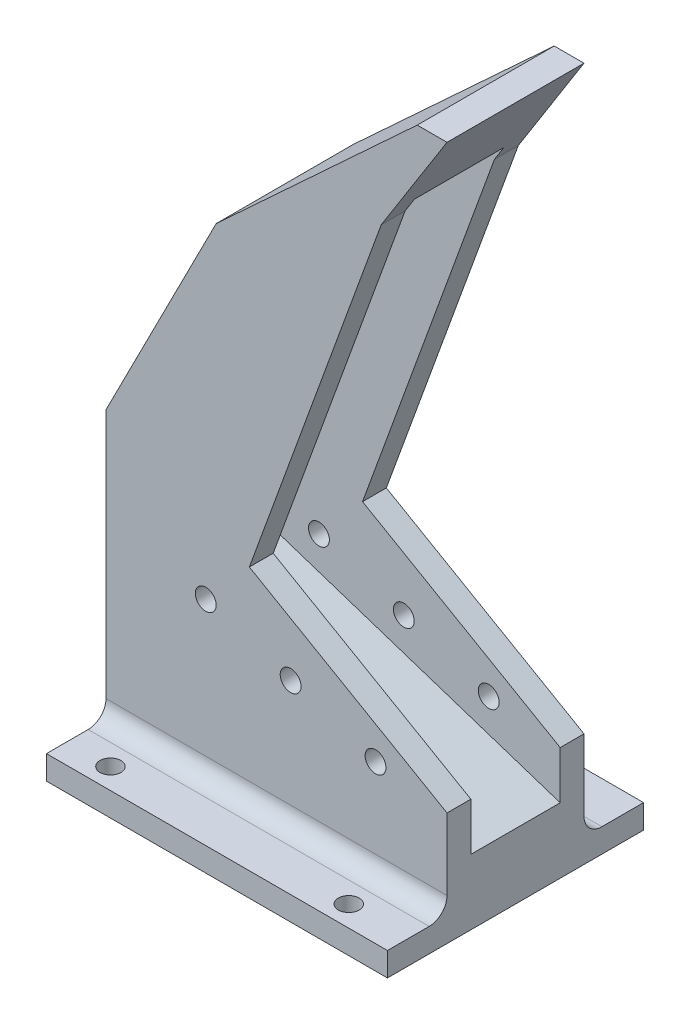
ISO-10303-21;
HEADER;
FILE_DESCRIPTION(('STEP AP214'),'2;1');
FILE_NAME('part.step','',(''),(''),'','','');
FILE_SCHEMA(('AUTOMOTIVE_DESIGN { 1 0 10303 214 1 1 1 1 }'));
ENDSEC;
DATA;
#1=APPLICATION_CONTEXT('core data for automotive mechanical design processes');
#2=APPLICATION_PROTOCOL_DEFINITION('international standard','automotive_design',2000,#1);
#3=PRODUCT_CONTEXT('',#1,'mechanical');
#4=PRODUCT('Part','Part','',(#3));
#5=PRODUCT_RELATED_PRODUCT_CATEGORY('part','',(#4));
#6=PRODUCT_DEFINITION_FORMATION('','',#4);
#7=PRODUCT_DEFINITION_CONTEXT('part definition',#1,'design');
#8=PRODUCT_DEFINITION('design','',#6,#7);
#9=PRODUCT_DEFINITION_SHAPE('','',#8);
#10=(LENGTH_UNIT() NAMED_UNIT(*) SI_UNIT(.MILLI.,.METRE.));
#11=(NAMED_UNIT(*) PLANE_ANGLE_UNIT() SI_UNIT($,.RADIAN.));
#12=(NAMED_UNIT(*) SI_UNIT($,.STERADIAN.) SOLID_ANGLE_UNIT());
#13=UNCERTAINTY_MEASURE_WITH_UNIT(LENGTH_MEASURE(1.E-05),#10,'distance_accuracy_value','');
#14=(GEOMETRIC_REPRESENTATION_CONTEXT(3) GLOBAL_UNCERTAINTY_ASSIGNED_CONTEXT((#13)) GLOBAL_UNIT_ASSIGNED_CONTEXT((#10,
#11,#12)) REPRESENTATION_CONTEXT('',''));
#15=CARTESIAN_POINT('',(0.,0.,0.));
#16=DIRECTION('',(0.,0.,1.));
#17=DIRECTION('',(1.,0.,0.));
#18=AXIS2_PLACEMENT_3D('',#15,#16,#17);
#19=CARTESIAN_POINT('',(57.2500555458633,0.,11.5));
#20=DIRECTION('',(-1.,0.,0.));
#21=DIRECTION('',(0.,0.,1.));
#22=AXIS2_PLACEMENT_3D('',#19,#20,#21);
#23=PLANE('',#22);
#24=DIRECTION('',(0.,1.,0.));
#25=VECTOR('',#24,1.);
#26=CARTESIAN_POINT('',(57.2500555458633,0.,11.5));
#27=LINE('',#26,#25);
#28=CARTESIAN_POINT('',(57.2500555458633,3.,11.5));
#29=VERTEX_POINT('',#28);
#30=CARTESIAN_POINT('',(57.2500555458633,15.,11.5));
#31=VERTEX_POINT('',#30);
#32=EDGE_CURVE('E381',#29,#31,#27,.T.);
#33=ORIENTED_EDGE('',*,*,#32,.F.);
#34=CARTESIAN_POINT('',(57.2500555458633,3.,14.5));
#35=DIRECTION('',(-1.,0.,0.));
#36=DIRECTION('',(0.,0.,1.));
#37=AXIS2_PLACEMENT_3D('',#34,#35,#36);
#38=CIRCLE('',#37,3.);
#39=CARTESIAN_POINT('',(57.2500555458633,0.,14.5));
#40=VERTEX_POINT('',#39);
#41=EDGE_CURVE('E455',#29,#40,#38,.T.);
#42=ORIENTED_EDGE('',*,*,#41,.T.);
#43=DIRECTION('',(0.,0.,1.));
#44=VECTOR('',#43,1.);
#45=CARTESIAN_POINT('',(57.2500555458633,0.,21.5));
#46=LINE('',#45,#44);
#47=CARTESIAN_POINT('',(57.2500555458633,0.,21.5));
#48=VERTEX_POINT('',#47);
#49=EDGE_CURVE('E276',#40,#48,#46,.T.);
#50=ORIENTED_EDGE('',*,*,#49,.T.);
#51=DIRECTION('',(0.,1.,0.));
#52=VECTOR('',#51,1.);
#53=CARTESIAN_POINT('',(57.2500555458633,-4.,21.5));
#54=LINE('',#53,#52);
#55=CARTESIAN_POINT('',(57.2500555458633,-4.,21.5));
#56=VERTEX_POINT('',#55);
#57=EDGE_CURVE('E258',#56,#48,#54,.T.);
#58=ORIENTED_EDGE('',*,*,#57,.F.);
#59=DIRECTION('',(0.,0.,1.));
#60=VECTOR('',#59,1.);
#61=CARTESIAN_POINT('',(57.2500555458633,-4.,21.5));
#62=LINE('',#61,#60);
#63=CARTESIAN_POINT('',(57.2500555458633,-4.,-21.5));
#64=VERTEX_POINT('',#63);
#65=EDGE_CURVE('E264',#64,#56,#62,.T.);
#66=ORIENTED_EDGE('',*,*,#65,.F.);
#67=DIRECTION('',(0.,1.,0.));
#68=VECTOR('',#67,1.);
#69=CARTESIAN_POINT('',(57.2500555458633,-4.,-21.5));
#70=LINE('',#69,#68);
#71=CARTESIAN_POINT('',(57.2500555458633,0.,-21.5));
#72=VERTEX_POINT('',#71);
#73=EDGE_CURVE('E490',#64,#72,#70,.T.);
#74=ORIENTED_EDGE('',*,*,#73,.T.);
#75=CARTESIAN_POINT('',(57.2500555458633,0.,-14.5));
#76=VERTEX_POINT('',#75);
#77=EDGE_CURVE('E477',#72,#76,#46,.T.);
#78=ORIENTED_EDGE('',*,*,#77,.T.);
#79=CARTESIAN_POINT('',(57.2500555458633,3.,-14.5));
#80=DIRECTION('',(-1.,0.,0.));
#81=DIRECTION('',(0.,0.,1.));
#82=AXIS2_PLACEMENT_3D('',#79,#80,#81);
#83=CIRCLE('',#82,3.);
#84=CARTESIAN_POINT('',(57.2500555458633,3.,-11.5));
#85=VERTEX_POINT('',#84);
#86=EDGE_CURVE('E102',#76,#85,#83,.T.);
#87=ORIENTED_EDGE('',*,*,#86,.T.);
#88=DIRECTION('',(0.,1.,0.));
#89=VECTOR('',#88,1.);
#90=CARTESIAN_POINT('',(57.2500555458633,0.,-11.5));
#91=LINE('',#90,#89);
#92=CARTESIAN_POINT('',(57.2500555458633,15.,-11.5));
#93=VERTEX_POINT('',#92);
#94=EDGE_CURVE('E401',#85,#93,#91,.T.);
#95=ORIENTED_EDGE('',*,*,#94,.T.);
#96=DIRECTION('',(0.,0.,-1.));
#97=VECTOR('',#96,1.);
#98=CARTESIAN_POINT('',(57.2500555458633,15.,11.5));
#99=LINE('',#98,#97);
#100=CARTESIAN_POINT('',(57.2500555458633,15.,-7.5));
#101=VERTEX_POINT('',#100);
#102=EDGE_CURVE('E415',#101,#93,#99,.T.);
#103=ORIENTED_EDGE('',*,*,#102,.F.);
#104=DIRECTION('',(0.,1.,0.));
#105=VECTOR('',#104,1.);
#106=CARTESIAN_POINT('',(57.2500555458633,0.,-7.5));
#107=LINE('',#106,#105);
#108=CARTESIAN_POINT('',(57.2500555458633,6.97368477004083,-7.5));
#109=VERTEX_POINT('',#108);
#110=EDGE_CURVE('E363',#109,#101,#107,.T.);
#111=ORIENTED_EDGE('',*,*,#110,.F.);
#112=DIRECTION('',(0.,0.,1.));
#113=VECTOR('',#112,1.);
#114=CARTESIAN_POINT('',(57.2500555458633,6.97368477004083,-7.5));
#115=LINE('',#114,#113);
#116=CARTESIAN_POINT('',(57.2500555458633,6.97368477004083,7.5));
#117=VERTEX_POINT('',#116);
#118=EDGE_CURVE('E326',#109,#117,#115,.T.);
#119=ORIENTED_EDGE('',*,*,#118,.T.);
#120=DIRECTION('',(0.,1.,0.));
#121=VECTOR('',#120,1.);
#122=CARTESIAN_POINT('',(57.2500555458633,0.,7.5));
#123=LINE('',#122,#121);
#124=CARTESIAN_POINT('',(57.2500555458633,15.,7.5));
#125=VERTEX_POINT('',#124);
#126=EDGE_CURVE('E355',#117,#125,#123,.T.);
#127=ORIENTED_EDGE('',*,*,#126,.T.);
#128=EDGE_CURVE('E416',#31,#125,#99,.T.);
#129=ORIENTED_EDGE('',*,*,#128,.F.);
#130=EDGE_LOOP('',(#33,#42,#50,#58,#66,#74,#78,#87,#95,#103,#111,#119,#127,#129));
#131=FACE_BOUND('',#130,.T.);
#132=ADVANCED_FACE('F94',(#131),#23,.F.);
#133=CARTESIAN_POINT('',(57.2500555458633,15.,11.5));
#134=DIRECTION('',(-0.499999999999995,-0.866025403784442,0.));
#135=DIRECTION('',(0.866025403784442,-0.499999999999995,0.));
#136=AXIS2_PLACEMENT_3D('',#133,#134,#135);
#137=PLANE('',#136);
#138=DIRECTION('',(-0.866025403784442,0.499999999999995,0.));
#139=VECTOR('',#138,1.);
#140=CARTESIAN_POINT('',(57.2500555458633,15.,-7.5));
#141=LINE('',#140,#139);
#142=CARTESIAN_POINT('',(24.0660110218741,34.1588170387254,-7.5));
#143=VERTEX_POINT('',#142);
#144=EDGE_CURVE('E361',#101,#143,#141,.T.);
#145=ORIENTED_EDGE('',*,*,#144,.F.);
#146=ORIENTED_EDGE('',*,*,#102,.T.);
#147=DIRECTION('',(-0.866025403784442,0.499999999999995,0.));
#148=VECTOR('',#147,1.);
#149=CARTESIAN_POINT('',(57.2500555458633,15.,-11.5));
#150=LINE('',#149,#148);
#151=CARTESIAN_POINT('',(24.0660110218741,34.1588170387254,-11.5));
#152=VERTEX_POINT('',#151);
#153=EDGE_CURVE('E403',#93,#152,#150,.T.);
#154=ORIENTED_EDGE('',*,*,#153,.T.);
#155=DIRECTION('',(0.,0.,-1.));
#156=VECTOR('',#155,1.);
#157=CARTESIAN_POINT('',(24.0660110218741,34.1588170387254,11.5));
#158=LINE('',#157,#156);
#159=EDGE_CURVE('E411',#143,#152,#158,.T.);
#160=ORIENTED_EDGE('',*,*,#159,.F.);
#161=EDGE_LOOP('',(#145,#146,#154,#160));
#162=FACE_BOUND('',#161,.T.);
#163=ADVANCED_FACE('F533',(#162),#137,.F.);
#164=CARTESIAN_POINT('',(24.0660110218741,34.1588170387254,11.5));
#165=DIRECTION('',(-0.93969262078591,0.342020143325665,0.));
#166=DIRECTION('',(-0.342020143325665,-0.93969262078591,0.));
#167=AXIS2_PLACEMENT_3D('',#164,#165,#166);
#168=PLANE('',#167);
#169=DIRECTION('',(0.342020143325665,0.93969262078591,0.));
#170=VECTOR('',#169,1.);
#171=CARTESIAN_POINT('',(24.0660110218741,34.1588170387254,-7.5));
#172=LINE('',#171,#170);
#173=CARTESIAN_POINT('',(46.2103906373218,95.,-7.5));
#174=VERTEX_POINT('',#173);
#175=EDGE_CURVE('E430',#143,#174,#172,.T.);
#176=ORIENTED_EDGE('',*,*,#175,.F.);
#177=ORIENTED_EDGE('',*,*,#159,.T.);
#178=DIRECTION('',(0.342020143325665,0.93969262078591,0.));
#179=VECTOR('',#178,1.);
#180=CARTESIAN_POINT('',(24.0660110218741,34.1588170387254,-11.5));
#181=LINE('',#180,#179);
#182=CARTESIAN_POINT('',(46.2103906373218,95.,-11.5));
#183=VERTEX_POINT('',#182);
#184=EDGE_CURVE('E372',#152,#183,#181,.T.);
#185=ORIENTED_EDGE('',*,*,#184,.T.);
#186=DIRECTION('',(0.,0.,-1.));
#187=VECTOR('',#186,1.);
#188=CARTESIAN_POINT('',(46.2103906373218,95.,11.5));
#189=LINE('',#188,#187);
#190=EDGE_CURVE('E387',#174,#183,#189,.T.);
#191=ORIENTED_EDGE('',*,*,#190,.F.);
#192=EDGE_LOOP('',(#176,#177,#185,#191));
#193=FACE_BOUND('',#192,.T.);
#194=ADVANCED_FACE('F527',(#193),#168,.F.);
#195=CARTESIAN_POINT('',(46.2103906373218,95.,11.5));
#196=DIRECTION('',(-0.845771719595629,0.533544935626094,0.));
#197=DIRECTION('',(-0.533544935626094,-0.845771719595629,0.));
#198=AXIS2_PLACEMENT_3D('',#195,#196,#197);
#199=PLANE('',#198);
#200=DIRECTION('',(0.,0.,1.));
#201=VECTOR('',#200,1.);
#202=CARTESIAN_POINT('',(47.7874856242563,97.5,-7.5));
#203=LINE('',#202,#201);
#204=CARTESIAN_POINT('',(47.7874856242563,97.5,-7.5));
#205=VERTEX_POINT('',#204);
#206=CARTESIAN_POINT('',(47.7874856242563,97.5,7.5));
#207=VERTEX_POINT('',#206);
#208=EDGE_CURVE('E340',#205,#207,#203,.T.);
#209=ORIENTED_EDGE('',*,*,#208,.F.);
#210=DIRECTION('',(0.533544935626094,0.845771719595629,0.));
#211=VECTOR('',#210,1.);
#212=CARTESIAN_POINT('',(46.2103906373218,95.,-7.5));
#213=LINE('',#212,#211);
#214=EDGE_CURVE('E365',#174,#205,#213,.T.);
#215=ORIENTED_EDGE('',*,*,#214,.F.);
#216=ORIENTED_EDGE('',*,*,#190,.T.);
#217=DIRECTION('',(0.533544935626094,0.845771719595629,0.));
#218=VECTOR('',#217,1.);
#219=CARTESIAN_POINT('',(46.2103906373218,95.,-11.5));
#220=LINE('',#219,#218);
#221=CARTESIAN_POINT('',(57.2500555458633,112.5,-11.5));
#222=VERTEX_POINT('',#221);
#223=EDGE_CURVE('E367',#183,#222,#220,.T.);
#224=ORIENTED_EDGE('',*,*,#223,.T.);
#225=DIRECTION('',(0.,0.,-1.));
#226=VECTOR('',#225,1.);
#227=CARTESIAN_POINT('',(57.2500555458633,112.5,11.5));
#228=LINE('',#227,#226);
#229=CARTESIAN_POINT('',(57.2500555458633,112.5,11.5));
#230=VERTEX_POINT('',#229);
#231=EDGE_CURVE('E425',#230,#222,#228,.T.);
#232=ORIENTED_EDGE('',*,*,#231,.F.);
#233=DIRECTION('',(0.533544935626094,0.845771719595629,0.));
#234=VECTOR('',#233,1.);
#235=CARTESIAN_POINT('',(46.2103906373218,95.,11.5));
#236=LINE('',#235,#234);
#237=CARTESIAN_POINT('',(46.2103906373218,95.,11.5));
#238=VERTEX_POINT('',#237);
#239=EDGE_CURVE('E368',#238,#230,#236,.T.);
#240=ORIENTED_EDGE('',*,*,#239,.F.);
#241=CARTESIAN_POINT('',(46.2103906373218,95.,7.5));
#242=VERTEX_POINT('',#241);
#243=EDGE_CURVE('E408',#238,#242,#189,.T.);
#244=ORIENTED_EDGE('',*,*,#243,.T.);
#245=DIRECTION('',(0.533544935626094,0.845771719595629,0.));
#246=VECTOR('',#245,1.);
#247=CARTESIAN_POINT('',(46.2103906373218,95.,7.5));
#248=LINE('',#247,#246);
#249=EDGE_CURVE('E358',#242,#207,#248,.T.);
#250=ORIENTED_EDGE('',*,*,#249,.T.);
#251=EDGE_LOOP('',(#209,#215,#216,#224,#232,#240,#244,#250));
#252=FACE_BOUND('',#251,.T.);
#253=ADVANCED_FACE('F521',(#252),#199,.F.);
#254=CARTESIAN_POINT('',(57.2500555458633,112.5,11.5));
#255=DIRECTION('',(0.,-1.,0.));
#256=DIRECTION('',(1.,0.,0.));
#257=AXIS2_PLACEMENT_3D('',#254,#255,#256);
#258=PLANE('',#257);
#259=ORIENTED_EDGE('',*,*,#231,.T.);
#260=DIRECTION('',(-1.,0.,0.));
#261=VECTOR('',#260,1.);
#262=CARTESIAN_POINT('',(57.2500555458633,112.5,-11.5));
#263=LINE('',#262,#261);
#264=CARTESIAN_POINT('',(52.2500555458633,112.5,-11.5));
#265=VERTEX_POINT('',#264);
#266=EDGE_CURVE('E390',#222,#265,#263,.T.);
#267=ORIENTED_EDGE('',*,*,#266,.T.);
#268=DIRECTION('',(0.,0.,-1.));
#269=VECTOR('',#268,1.);
#270=CARTESIAN_POINT('',(52.2500555458633,112.5,11.5));
#271=LINE('',#270,#269);
#272=CARTESIAN_POINT('',(52.2500555458633,112.5,11.5));
#273=VERTEX_POINT('',#272);
#274=EDGE_CURVE('E423',#273,#265,#271,.T.);
#275=ORIENTED_EDGE('',*,*,#274,.F.);
#276=DIRECTION('',(-1.,0.,0.));
#277=VECTOR('',#276,1.);
#278=CARTESIAN_POINT('',(57.2500555458633,112.5,11.5));
#279=LINE('',#278,#277);
#280=EDGE_CURVE('E371',#230,#273,#279,.T.);
#281=ORIENTED_EDGE('',*,*,#280,.F.);
#282=EDGE_LOOP('',(#259,#267,#275,#281));
#283=FACE_BOUND('',#282,.T.);
#284=ADVANCED_FACE('F515',(#283),#258,.F.);
#285=CARTESIAN_POINT('',(52.2500555458633,112.5,11.5));
#286=DIRECTION('',(0.678683956183813,-0.734430451178795,0.));
#287=DIRECTION('',(0.734430451178795,0.678683956183813,0.));
#288=AXIS2_PLACEMENT_3D('',#285,#286,#287);
#289=PLANE('',#288);
#290=ORIENTED_EDGE('',*,*,#274,.T.);
#291=DIRECTION('',(-0.734430451178795,-0.678683956183813,0.));
#292=VECTOR('',#291,1.);
#293=CARTESIAN_POINT('',(52.2500555458633,112.5,-11.5));
#294=LINE('',#293,#292);
#295=CARTESIAN_POINT('',(18.50330034999,81.3147716534072,-11.5));
#296=VERTEX_POINT('',#295);
#297=EDGE_CURVE('E393',#265,#296,#294,.T.);
#298=ORIENTED_EDGE('',*,*,#297,.T.);
#299=DIRECTION('',(0.,0.,-1.));
#300=VECTOR('',#299,1.);
#301=CARTESIAN_POINT('',(18.50330034999,81.3147716534072,11.5));
#302=LINE('',#301,#300);
#303=CARTESIAN_POINT('',(18.50330034999,81.3147716534072,11.5));
#304=VERTEX_POINT('',#303);
#305=EDGE_CURVE('E421',#304,#296,#302,.T.);
#306=ORIENTED_EDGE('',*,*,#305,.F.);
#307=DIRECTION('',(-0.734430451178795,-0.678683956183813,0.));
#308=VECTOR('',#307,1.);
#309=CARTESIAN_POINT('',(52.2500555458633,112.5,11.5));
#310=LINE('',#309,#308);
#311=EDGE_CURVE('E374',#273,#304,#310,.T.);
#312=ORIENTED_EDGE('',*,*,#311,.F.);
#313=EDGE_LOOP('',(#290,#298,#306,#312));
#314=FACE_BOUND('',#313,.T.);
#315=ADVANCED_FACE('F512',(#314),#289,.F.);
#316=CARTESIAN_POINT('',(18.50330034999,81.3147716534072,11.5));
#317=DIRECTION('',(0.891006524188366,-0.453990499739551,0.));
#318=DIRECTION('',(0.453990499739551,0.891006524188366,0.));
#319=AXIS2_PLACEMENT_3D('',#316,#317,#318);
#320=PLANE('',#319);
#321=ORIENTED_EDGE('',*,*,#305,.T.);
#322=DIRECTION('',(-0.453990499739551,-0.891006524188366,0.));
#323=VECTOR('',#322,1.);
#324=CARTESIAN_POINT('',(18.50330034999,81.3147716534072,-11.5));
#325=LINE('',#324,#323);
#326=CARTESIAN_POINT('',(0.,45.,-11.5));
#327=VERTEX_POINT('',#326);
#328=EDGE_CURVE('E396',#296,#327,#325,.T.);
#329=ORIENTED_EDGE('',*,*,#328,.T.);
#330=DIRECTION('',(0.,0.,-1.));
#331=VECTOR('',#330,1.);
#332=CARTESIAN_POINT('',(0.,45.,11.5));
#333=LINE('',#332,#331);
#334=CARTESIAN_POINT('',(0.,45.,11.5));
#335=VERTEX_POINT('',#334);
#336=EDGE_CURVE('E419',#335,#327,#333,.T.);
#337=ORIENTED_EDGE('',*,*,#336,.F.);
#338=DIRECTION('',(-0.453990499739551,-0.891006524188366,0.));
#339=VECTOR('',#338,1.);
#340=CARTESIAN_POINT('',(18.50330034999,81.3147716534072,11.5));
#341=LINE('',#340,#339);
#342=EDGE_CURVE('E376',#304,#335,#341,.T.);
#343=ORIENTED_EDGE('',*,*,#342,.F.);
#344=EDGE_LOOP('',(#321,#329,#337,#343));
#345=FACE_BOUND('',#344,.T.);
#346=ADVANCED_FACE('F508',(#345),#320,.F.);
#347=CARTESIAN_POINT('',(0.,45.,11.5));
#348=DIRECTION('',(1.,0.,0.));
#349=DIRECTION('',(0.,1.,0.));
#350=AXIS2_PLACEMENT_3D('',#347,#348,#349);
#351=PLANE('',#350);
#352=ORIENTED_EDGE('',*,*,#336,.T.);
#353=DIRECTION('',(0.,-1.,0.));
#354=VECTOR('',#353,1.);
#355=CARTESIAN_POINT('',(0.,45.,-11.5));
#356=LINE('',#355,#354);
#357=CARTESIAN_POINT('',(0.,3.00000000000002,-11.5));
#358=VERTEX_POINT('',#357);
#359=EDGE_CURVE('E399',#327,#358,#356,.T.);
#360=ORIENTED_EDGE('',*,*,#359,.T.);
#361=CARTESIAN_POINT('',(0.,3.,-14.5));
#362=DIRECTION('',(1.,0.,0.));
#363=DIRECTION('',(0.,1.,0.));
#364=AXIS2_PLACEMENT_3D('',#361,#362,#363);
#365=CIRCLE('',#364,3.);
#366=CARTESIAN_POINT('',(0.,0.,-14.5));
#367=VERTEX_POINT('',#366);
#368=EDGE_CURVE('E13',#358,#367,#365,.T.);
#369=ORIENTED_EDGE('',*,*,#368,.T.);
#370=DIRECTION('',(0.,0.,-1.));
#371=VECTOR('',#370,1.);
#372=CARTESIAN_POINT('',(0.,0.,21.5));
#373=LINE('',#372,#371);
#374=CARTESIAN_POINT('',(0.,0.,-21.5));
#375=VERTEX_POINT('',#374);
#376=EDGE_CURVE('E487',#367,#375,#373,.T.);
#377=ORIENTED_EDGE('',*,*,#376,.T.);
#378=DIRECTION('',(0.,1.,0.));
#379=VECTOR('',#378,1.);
#380=CARTESIAN_POINT('',(0.,-4.,-21.5));
#381=LINE('',#380,#379);
#382=CARTESIAN_POINT('',(0.,-4.,-21.5));
#383=VERTEX_POINT('',#382);
#384=EDGE_CURVE('E283',#383,#375,#381,.T.);
#385=ORIENTED_EDGE('',*,*,#384,.F.);
#386=DIRECTION('',(0.,0.,-1.));
#387=VECTOR('',#386,1.);
#388=CARTESIAN_POINT('',(0.,-4.,21.5));
#389=LINE('',#388,#387);
#390=CARTESIAN_POINT('',(0.,-4.,21.5));
#391=VERTEX_POINT('',#390);
#392=EDGE_CURVE('E263',#391,#383,#389,.T.);
#393=ORIENTED_EDGE('',*,*,#392,.F.);
#394=DIRECTION('',(0.,1.,0.));
#395=VECTOR('',#394,1.);
#396=CARTESIAN_POINT('',(0.,-4.,21.5));
#397=LINE('',#396,#395);
#398=CARTESIAN_POINT('',(0.,0.,21.5));
#399=VERTEX_POINT('',#398);
#400=EDGE_CURVE('E260',#391,#399,#397,.T.);
#401=ORIENTED_EDGE('',*,*,#400,.T.);
#402=CARTESIAN_POINT('',(0.,0.,14.5));
#403=VERTEX_POINT('',#402);
#404=EDGE_CURVE('E464',#399,#403,#373,.T.);
#405=ORIENTED_EDGE('',*,*,#404,.T.);
#406=CARTESIAN_POINT('',(0.,3.,14.5));
#407=DIRECTION('',(1.,0.,0.));
#408=DIRECTION('',(0.,1.,0.));
#409=AXIS2_PLACEMENT_3D('',#406,#407,#408);
#410=CIRCLE('',#409,3.);
#411=CARTESIAN_POINT('',(0.,3.00000000000002,11.5));
#412=VERTEX_POINT('',#411);
#413=EDGE_CURVE('E457',#403,#412,#410,.T.);
#414=ORIENTED_EDGE('',*,*,#413,.T.);
#415=DIRECTION('',(0.,-1.,0.));
#416=VECTOR('',#415,1.);
#417=CARTESIAN_POINT('',(0.,45.,11.5));
#418=LINE('',#417,#416);
#419=EDGE_CURVE('E378',#335,#412,#418,.T.);
#420=ORIENTED_EDGE('',*,*,#419,.F.);
#421=EDGE_LOOP('',(#352,#360,#369,#377,#385,#393,#401,#405,#414,#420));
#422=FACE_BOUND('',#421,.T.);
#423=ADVANCED_FACE('F462',(#422),#351,.F.);
#424=ORIENTED_EDGE('',*,*,#128,.T.);
#425=DIRECTION('',(-0.866025403784442,0.499999999999995,0.));
#426=VECTOR('',#425,1.);
#427=CARTESIAN_POINT('',(57.2500555458633,15.,7.5));
#428=LINE('',#427,#426);
#429=CARTESIAN_POINT('',(24.0660110218741,34.1588170387254,7.5));
#430=VERTEX_POINT('',#429);
#431=EDGE_CURVE('E342',#125,#430,#428,.T.);
#432=ORIENTED_EDGE('',*,*,#431,.T.);
#433=CARTESIAN_POINT('',(24.0660110218741,34.1588170387254,11.5));
#434=VERTEX_POINT('',#433);
#435=EDGE_CURVE('E412',#434,#430,#158,.T.);
#436=ORIENTED_EDGE('',*,*,#435,.F.);
#437=DIRECTION('',(-0.866025403784442,0.499999999999995,0.));
#438=VECTOR('',#437,1.);
#439=CARTESIAN_POINT('',(57.2500555458633,15.,11.5));
#440=LINE('',#439,#438);
#441=EDGE_CURVE('E383',#31,#434,#440,.T.);
#442=ORIENTED_EDGE('',*,*,#441,.F.);
#443=EDGE_LOOP('',(#424,#432,#436,#442));
#444=FACE_BOUND('',#443,.T.);
#445=ADVANCED_FACE('F570',(#444),#137,.F.);
#446=ORIENTED_EDGE('',*,*,#435,.T.);
#447=DIRECTION('',(0.342020143325665,0.93969262078591,0.));
#448=VECTOR('',#447,1.);
#449=CARTESIAN_POINT('',(24.0660110218741,34.1588170387254,7.5));
#450=LINE('',#449,#448);
#451=EDGE_CURVE('E427',#430,#242,#450,.T.);
#452=ORIENTED_EDGE('',*,*,#451,.T.);
#453=ORIENTED_EDGE('',*,*,#243,.F.);
#454=DIRECTION('',(0.342020143325665,0.93969262078591,0.));
#455=VECTOR('',#454,1.);
#456=CARTESIAN_POINT('',(24.0660110218741,34.1588170387254,11.5));
#457=LINE('',#456,#455);
#458=EDGE_CURVE('E385',#434,#238,#457,.T.);
#459=ORIENTED_EDGE('',*,*,#458,.F.);
#460=EDGE_LOOP('',(#446,#452,#453,#459));
#461=FACE_BOUND('',#460,.T.);
#462=ADVANCED_FACE('F567',(#461),#168,.F.);
#463=CARTESIAN_POINT('',(0.,0.,11.5));
#464=DIRECTION('',(0.,0.,1.));
#465=DIRECTION('',(1.,0.,0.));
#466=AXIS2_PLACEMENT_3D('',#463,#464,#465);
#467=PLANE('',#466);
#468=CARTESIAN_POINT('',(45.2500555458633,16.4441662568016,11.5));
#469=DIRECTION('',(0.,0.,1.));
#470=DIRECTION('',(1.,0.,0.));
#471=AXIS2_PLACEMENT_3D('',#468,#469,#470);
#472=CIRCLE('',#471,1.75);
#473=CARTESIAN_POINT('',(47.0000555458633,16.4441662568016,11.5));
#474=VERTEX_POINT('',#473);
#475=EDGE_CURVE('E310',#474,#474,#472,.T.);
#476=ORIENTED_EDGE('',*,*,#475,.F.);
#477=EDGE_LOOP('',(#476));
#478=FACE_BOUND('',#477,.T.);
#479=CARTESIAN_POINT('',(31.0000403969915,21.1278686658925,11.5));
#480=DIRECTION('',(0.,0.,1.));
#481=DIRECTION('',(1.,0.,0.));
#482=AXIS2_PLACEMENT_3D('',#479,#480,#481);
#483=CIRCLE('',#482,1.75);
#484=CARTESIAN_POINT('',(32.7500403969915,21.1278686658925,11.5));
#485=VERTEX_POINT('',#484);
#486=EDGE_CURVE('E303',#485,#485,#483,.T.);
#487=ORIENTED_EDGE('',*,*,#486,.F.);
#488=EDGE_LOOP('',(#487));
#489=FACE_BOUND('',#488,.T.);
#490=CARTESIAN_POINT('',(16.7500252481197,25.8115710749834,11.5));
#491=DIRECTION('',(0.,0.,1.));
#492=DIRECTION('',(1.,0.,0.));
#493=AXIS2_PLACEMENT_3D('',#490,#491,#492);
#494=CIRCLE('',#493,1.75);
#495=CARTESIAN_POINT('',(18.5000252481197,25.8115710749834,11.5));
#496=VERTEX_POINT('',#495);
#497=EDGE_CURVE('E296',#496,#496,#494,.T.);
#498=ORIENTED_EDGE('',*,*,#497,.F.);
#499=EDGE_LOOP('',(#498));
#500=FACE_BOUND('',#499,.T.);
#501=ORIENTED_EDGE('',*,*,#419,.T.);
#502=DIRECTION('',(1.,0.,0.));
#503=VECTOR('',#502,1.);
#504=CARTESIAN_POINT('',(0.,3.,11.5));
#505=LINE('',#504,#503);
#506=EDGE_CURVE('E432',#412,#29,#505,.T.);
#507=ORIENTED_EDGE('',*,*,#506,.T.);
#508=ORIENTED_EDGE('',*,*,#32,.T.);
#509=ORIENTED_EDGE('',*,*,#441,.T.);
#510=ORIENTED_EDGE('',*,*,#458,.T.);
#511=ORIENTED_EDGE('',*,*,#239,.T.);
#512=ORIENTED_EDGE('',*,*,#280,.T.);
#513=ORIENTED_EDGE('',*,*,#311,.T.);
#514=ORIENTED_EDGE('',*,*,#342,.T.);
#515=EDGE_LOOP('',(#501,#507,#508,#509,#510,#511,#512,#513,#514));
#516=FACE_BOUND('',#515,.T.);
#517=ADVANCED_FACE('F469',(#478,#489,#500,#516),#467,.T.);
#518=CARTESIAN_POINT('',(0.,0.,-11.5));
#519=DIRECTION('',(0.,0.,1.));
#520=DIRECTION('',(1.,0.,0.));
#521=AXIS2_PLACEMENT_3D('',#518,#519,#520);
#522=PLANE('',#521);
#523=CARTESIAN_POINT('',(45.2500555458633,16.4441662568016,-11.5));
#524=DIRECTION('',(0.,0.,1.));
#525=DIRECTION('',(1.,0.,0.));
#526=AXIS2_PLACEMENT_3D('',#523,#524,#525);
#527=CIRCLE('',#526,1.75);
#528=CARTESIAN_POINT('',(47.0000555458633,16.4441662568016,-11.5));
#529=VERTEX_POINT('',#528);
#530=EDGE_CURVE('E287',#529,#529,#527,.T.);
#531=ORIENTED_EDGE('',*,*,#530,.T.);
#532=EDGE_LOOP('',(#531));
#533=FACE_BOUND('',#532,.T.);
#534=CARTESIAN_POINT('',(31.0000403969915,21.1278686658925,-11.5));
#535=DIRECTION('',(0.,0.,1.));
#536=DIRECTION('',(1.,0.,0.));
#537=AXIS2_PLACEMENT_3D('',#534,#535,#536);
#538=CIRCLE('',#537,1.75);
#539=CARTESIAN_POINT('',(32.7500403969915,21.1278686658925,-11.5));
#540=VERTEX_POINT('',#539);
#541=EDGE_CURVE('E281',#540,#540,#538,.T.);
#542=ORIENTED_EDGE('',*,*,#541,.T.);
#543=EDGE_LOOP('',(#542));
#544=FACE_BOUND('',#543,.T.);
#545=CARTESIAN_POINT('',(16.7500252481197,25.8115710749834,-11.5));
#546=DIRECTION('',(0.,0.,1.));
#547=DIRECTION('',(1.,0.,0.));
#548=AXIS2_PLACEMENT_3D('',#545,#546,#547);
#549=CIRCLE('',#548,1.75);
#550=CARTESIAN_POINT('',(18.5000252481197,25.8115710749834,-11.5));
#551=VERTEX_POINT('',#550);
#552=EDGE_CURVE('E278',#551,#551,#549,.T.);
#553=ORIENTED_EDGE('',*,*,#552,.T.);
#554=EDGE_LOOP('',(#553));
#555=FACE_BOUND('',#554,.T.);
#556=ORIENTED_EDGE('',*,*,#94,.F.);
#557=DIRECTION('',(1.,0.,0.));
#558=VECTOR('',#557,1.);
#559=CARTESIAN_POINT('',(0.,3.,-11.5));
#560=LINE('',#559,#558);
#561=EDGE_CURVE('E109',#85,#358,#560,.F.);
#562=ORIENTED_EDGE('',*,*,#561,.T.);
#563=ORIENTED_EDGE('',*,*,#359,.F.);
#564=ORIENTED_EDGE('',*,*,#328,.F.);
#565=ORIENTED_EDGE('',*,*,#297,.F.);
#566=ORIENTED_EDGE('',*,*,#266,.F.);
#567=ORIENTED_EDGE('',*,*,#223,.F.);
#568=ORIENTED_EDGE('',*,*,#184,.F.);
#569=ORIENTED_EDGE('',*,*,#153,.F.);
#570=EDGE_LOOP('',(#556,#562,#563,#564,#565,#566,#567,#568,#569));
#571=FACE_BOUND('',#570,.T.);
#572=ADVANCED_FACE('F504',(#533,#544,#555,#571),#522,.F.);
#573=CARTESIAN_POINT('',(28.6250277729317,56.25,-7.5));
#574=DIRECTION('',(0.,0.,1.));
#575=DIRECTION('',(1.,0.,0.));
#576=AXIS2_PLACEMENT_3D('',#573,#574,#575);
#577=PLANE('',#576);
#578=CARTESIAN_POINT('',(45.2500555458633,16.4441662568016,-7.5));
#579=DIRECTION('',(0.,0.,1.));
#580=DIRECTION('',(1.,0.,0.));
#581=AXIS2_PLACEMENT_3D('',#578,#579,#580);
#582=CIRCLE('',#581,1.75);
#583=CARTESIAN_POINT('',(47.0000555458633,16.4441662568016,-7.5));
#584=VERTEX_POINT('',#583);
#585=EDGE_CURVE('E307',#584,#584,#582,.T.);
#586=ORIENTED_EDGE('',*,*,#585,.F.);
#587=EDGE_LOOP('',(#586));
#588=FACE_BOUND('',#587,.T.);
#589=CARTESIAN_POINT('',(31.0000403969915,21.1278686658925,-7.5));
#590=DIRECTION('',(0.,0.,1.));
#591=DIRECTION('',(1.,0.,0.));
#592=AXIS2_PLACEMENT_3D('',#589,#590,#591);
#593=CIRCLE('',#592,1.75);
#594=CARTESIAN_POINT('',(32.7500403969915,21.1278686658925,-7.5));
#595=VERTEX_POINT('',#594);
#596=EDGE_CURVE('E300',#595,#595,#593,.T.);
#597=ORIENTED_EDGE('',*,*,#596,.F.);
#598=EDGE_LOOP('',(#597));
#599=FACE_BOUND('',#598,.T.);
#600=CARTESIAN_POINT('',(16.7500252481197,25.8115710749834,-7.5));
#601=DIRECTION('',(0.,0.,1.));
#602=DIRECTION('',(1.,0.,0.));
#603=AXIS2_PLACEMENT_3D('',#600,#601,#602);
#604=CIRCLE('',#603,1.75);
#605=CARTESIAN_POINT('',(18.5000252481197,25.8115710749834,-7.5));
#606=VERTEX_POINT('',#605);
#607=EDGE_CURVE('E293',#606,#606,#604,.T.);
#608=ORIENTED_EDGE('',*,*,#607,.F.);
#609=EDGE_LOOP('',(#608));
#610=FACE_BOUND('',#609,.T.);
#611=ORIENTED_EDGE('',*,*,#214,.T.);
#612=DIRECTION('',(0.,1.,0.));
#613=VECTOR('',#612,1.);
#614=CARTESIAN_POINT('',(47.7874856242565,0.,-7.5));
#615=LINE('',#614,#613);
#616=CARTESIAN_POINT('',(47.7874856242563,102.929761459561,-7.5));
#617=VERTEX_POINT('',#616);
#618=EDGE_CURVE('E324',#205,#617,#615,.T.);
#619=ORIENTED_EDGE('',*,*,#618,.T.);
#620=DIRECTION('',(0.734430451178795,0.678683956183813,0.));
#621=VECTOR('',#620,1.);
#622=CARTESIAN_POINT('',(-29.2934596348922,31.6995982890376,-7.5));
#623=LINE('',#622,#621);
#624=CARTESIAN_POINT('',(21.742887774807,78.8620629085142,-7.5));
#625=VERTEX_POINT('',#624);
#626=EDGE_CURVE('E321',#625,#617,#623,.T.);
#627=ORIENTED_EDGE('',*,*,#626,.F.);
#628=DIRECTION('',(-0.453990499739551,-0.891006524188366,0.));
#629=VECTOR('',#628,1.);
#630=CARTESIAN_POINT('',(-14.638856276683,7.45886982446131,-7.5));
#631=LINE('',#630,#629);
#632=CARTESIAN_POINT('',(4.,44.0396849636795,-7.5));
#633=VERTEX_POINT('',#632);
#634=EDGE_CURVE('E319',#625,#633,#631,.T.);
#635=ORIENTED_EDGE('',*,*,#634,.T.);
#636=DIRECTION('',(0.,-1.,0.));
#637=VECTOR('',#636,1.);
#638=CARTESIAN_POINT('',(4.,0.,-7.5));
#639=LINE('',#638,#637);
#640=CARTESIAN_POINT('',(4.,24.4759407914411,-7.5));
#641=VERTEX_POINT('',#640);
#642=EDGE_CURVE('E316',#633,#641,#639,.T.);
#643=ORIENTED_EDGE('',*,*,#642,.T.);
#644=DIRECTION('',(0.950001009924787,-0.312246827272729,0.));
#645=VECTOR('',#644,1.);
#646=CARTESIAN_POINT('',(7.65040815676343,23.2761227351528,-7.5));
#647=LINE('',#646,#645);
#648=EDGE_CURVE('E314',#641,#109,#647,.T.);
#649=ORIENTED_EDGE('',*,*,#648,.T.);
#650=ORIENTED_EDGE('',*,*,#110,.T.);
#651=ORIENTED_EDGE('',*,*,#144,.T.);
#652=ORIENTED_EDGE('',*,*,#175,.T.);
#653=EDGE_LOOP('',(#611,#619,#627,#635,#643,#649,#650,#651,#652));
#654=FACE_BOUND('',#653,.T.);
#655=ADVANCED_FACE('F538',(#588,#599,#610,#654),#577,.T.);
#656=CARTESIAN_POINT('',(28.6250277729317,56.25,7.5));
#657=DIRECTION('',(0.,0.,1.));
#658=DIRECTION('',(1.,0.,0.));
#659=AXIS2_PLACEMENT_3D('',#656,#657,#658);
#660=PLANE('',#659);
#661=CARTESIAN_POINT('',(45.2500555458633,16.4441662568016,7.5));
#662=DIRECTION('',(0.,0.,1.));
#663=DIRECTION('',(1.,0.,0.));
#664=AXIS2_PLACEMENT_3D('',#661,#662,#663);
#665=CIRCLE('',#664,1.75);
#666=CARTESIAN_POINT('',(47.0000555458633,16.4441662568016,7.5));
#667=VERTEX_POINT('',#666);
#668=EDGE_CURVE('E306',#667,#667,#665,.T.);
#669=ORIENTED_EDGE('',*,*,#668,.T.);
#670=EDGE_LOOP('',(#669));
#671=FACE_BOUND('',#670,.T.);
#672=CARTESIAN_POINT('',(31.0000403969915,21.1278686658925,7.5));
#673=DIRECTION('',(0.,0.,1.));
#674=DIRECTION('',(1.,0.,0.));
#675=AXIS2_PLACEMENT_3D('',#672,#673,#674);
#676=CIRCLE('',#675,1.75);
#677=CARTESIAN_POINT('',(32.7500403969915,21.1278686658925,7.5));
#678=VERTEX_POINT('',#677);
#679=EDGE_CURVE('E299',#678,#678,#676,.T.);
#680=ORIENTED_EDGE('',*,*,#679,.T.);
#681=EDGE_LOOP('',(#680));
#682=FACE_BOUND('',#681,.T.);
#683=CARTESIAN_POINT('',(16.7500252481197,25.8115710749834,7.5));
#684=DIRECTION('',(0.,0.,1.));
#685=DIRECTION('',(1.,0.,0.));
#686=AXIS2_PLACEMENT_3D('',#683,#684,#685);
#687=CIRCLE('',#686,1.75);
#688=CARTESIAN_POINT('',(18.5000252481197,25.8115710749834,7.5));
#689=VERTEX_POINT('',#688);
#690=EDGE_CURVE('E290',#689,#689,#687,.T.);
#691=ORIENTED_EDGE('',*,*,#690,.T.);
#692=EDGE_LOOP('',(#691));
#693=FACE_BOUND('',#692,.T.);
#694=ORIENTED_EDGE('',*,*,#451,.F.);
#695=ORIENTED_EDGE('',*,*,#431,.F.);
#696=ORIENTED_EDGE('',*,*,#126,.F.);
#697=DIRECTION('',(0.950001009924787,-0.312246827272729,0.));
#698=VECTOR('',#697,1.);
#699=CARTESIAN_POINT('',(7.65040815676343,23.2761227351528,7.5));
#700=LINE('',#699,#698);
#701=CARTESIAN_POINT('',(4.,24.4759407914411,7.5));
#702=VERTEX_POINT('',#701);
#703=EDGE_CURVE('E313',#702,#117,#700,.T.);
#704=ORIENTED_EDGE('',*,*,#703,.F.);
#705=DIRECTION('',(0.,-1.,0.));
#706=VECTOR('',#705,1.);
#707=CARTESIAN_POINT('',(4.,0.,7.5));
#708=LINE('',#707,#706);
#709=CARTESIAN_POINT('',(4.,44.0396849636795,7.5));
#710=VERTEX_POINT('',#709);
#711=EDGE_CURVE('E329',#710,#702,#708,.T.);
#712=ORIENTED_EDGE('',*,*,#711,.F.);
#713=DIRECTION('',(-0.453990499739551,-0.891006524188366,0.));
#714=VECTOR('',#713,1.);
#715=CARTESIAN_POINT('',(-14.638856276683,7.45886982446131,7.5));
#716=LINE('',#715,#714);
#717=CARTESIAN_POINT('',(21.742887774807,78.8620629085142,7.5));
#718=VERTEX_POINT('',#717);
#719=EDGE_CURVE('E332',#718,#710,#716,.T.);
#720=ORIENTED_EDGE('',*,*,#719,.F.);
#721=DIRECTION('',(0.734430451178795,0.678683956183813,0.));
#722=VECTOR('',#721,1.);
#723=CARTESIAN_POINT('',(-29.2934596348922,31.6995982890376,7.5));
#724=LINE('',#723,#722);
#725=CARTESIAN_POINT('',(47.7874856242563,102.929761459561,7.5));
#726=VERTEX_POINT('',#725);
#727=EDGE_CURVE('E335',#718,#726,#724,.T.);
#728=ORIENTED_EDGE('',*,*,#727,.T.);
#729=DIRECTION('',(0.,1.,0.));
#730=VECTOR('',#729,1.);
#731=CARTESIAN_POINT('',(47.7874856242565,0.,7.5));
#732=LINE('',#731,#730);
#733=EDGE_CURVE('E317',#207,#726,#732,.T.);
#734=ORIENTED_EDGE('',*,*,#733,.F.);
#735=ORIENTED_EDGE('',*,*,#249,.F.);
#736=EDGE_LOOP('',(#694,#695,#696,#704,#712,#720,#728,#734,#735));
#737=FACE_BOUND('',#736,.T.);
#738=ADVANCED_FACE('F547',(#671,#682,#693,#737),#660,.F.);
#739=CARTESIAN_POINT('',(47.7874856242565,0.,-7.5));
#740=DIRECTION('',(1.,0.,0.));
#741=DIRECTION('',(0.,1.,0.));
#742=AXIS2_PLACEMENT_3D('',#739,#740,#741);
#743=PLANE('',#742);
#744=ORIENTED_EDGE('',*,*,#733,.T.);
#745=DIRECTION('',(0.,0.,1.));
#746=VECTOR('',#745,1.);
#747=CARTESIAN_POINT('',(47.7874856242563,102.929761459561,-7.5));
#748=LINE('',#747,#746);
#749=EDGE_CURVE('E343',#617,#726,#748,.T.);
#750=ORIENTED_EDGE('',*,*,#749,.F.);
#751=ORIENTED_EDGE('',*,*,#618,.F.);
#752=ORIENTED_EDGE('',*,*,#208,.T.);
#753=EDGE_LOOP('',(#744,#750,#751,#752));
#754=FACE_BOUND('',#753,.T.);
#755=ADVANCED_FACE('F563',(#754),#743,.F.);
#756=CARTESIAN_POINT('',(-29.2934596348922,31.6995982890376,-7.5));
#757=DIRECTION('',(0.678683956183813,-0.734430451178795,0.));
#758=DIRECTION('',(0.734430451178795,0.678683956183813,0.));
#759=AXIS2_PLACEMENT_3D('',#756,#757,#758);
#760=PLANE('',#759);
#761=ORIENTED_EDGE('',*,*,#727,.F.);
#762=DIRECTION('',(0.,0.,1.));
#763=VECTOR('',#762,1.);
#764=CARTESIAN_POINT('',(21.742887774807,78.8620629085142,-7.5));
#765=LINE('',#764,#763);
#766=EDGE_CURVE('E345',#625,#718,#765,.T.);
#767=ORIENTED_EDGE('',*,*,#766,.F.);
#768=ORIENTED_EDGE('',*,*,#626,.T.);
#769=ORIENTED_EDGE('',*,*,#749,.T.);
#770=EDGE_LOOP('',(#761,#767,#768,#769));
#771=FACE_BOUND('',#770,.T.);
#772=ADVANCED_FACE('F558',(#771),#760,.T.);
#773=CARTESIAN_POINT('',(-14.638856276683,7.45886982446131,-7.5));
#774=DIRECTION('',(-0.891006524188366,0.453990499739551,0.));
#775=DIRECTION('',(-0.453990499739551,-0.891006524188366,0.));
#776=AXIS2_PLACEMENT_3D('',#773,#774,#775);
#777=PLANE('',#776);
#778=ORIENTED_EDGE('',*,*,#719,.T.);
#779=DIRECTION('',(0.,0.,1.));
#780=VECTOR('',#779,1.);
#781=CARTESIAN_POINT('',(4.,44.0396849636795,-7.5));
#782=LINE('',#781,#780);
#783=EDGE_CURVE('E347',#633,#710,#782,.T.);
#784=ORIENTED_EDGE('',*,*,#783,.F.);
#785=ORIENTED_EDGE('',*,*,#634,.F.);
#786=ORIENTED_EDGE('',*,*,#766,.T.);
#787=EDGE_LOOP('',(#778,#784,#785,#786));
#788=FACE_BOUND('',#787,.T.);
#789=ADVANCED_FACE('F554',(#788),#777,.F.);
#790=CARTESIAN_POINT('',(4.,0.,-7.5));
#791=DIRECTION('',(-1.,0.,0.));
#792=DIRECTION('',(0.,-1.,0.));
#793=AXIS2_PLACEMENT_3D('',#790,#791,#792);
#794=PLANE('',#793);
#795=ORIENTED_EDGE('',*,*,#711,.T.);
#796=DIRECTION('',(0.,0.,1.));
#797=VECTOR('',#796,1.);
#798=CARTESIAN_POINT('',(4.,24.4759407914411,-7.5));
#799=LINE('',#798,#797);
#800=EDGE_CURVE('E349',#641,#702,#799,.T.);
#801=ORIENTED_EDGE('',*,*,#800,.F.);
#802=ORIENTED_EDGE('',*,*,#642,.F.);
#803=ORIENTED_EDGE('',*,*,#783,.T.);
#804=EDGE_LOOP('',(#795,#801,#802,#803));
#805=FACE_BOUND('',#804,.T.);
#806=ADVANCED_FACE('F550',(#805),#794,.F.);
#807=CARTESIAN_POINT('',(7.65040815676343,23.2761227351528,-7.5));
#808=DIRECTION('',(-0.312246827272729,-0.950001009924787,0.));
#809=DIRECTION('',(0.950001009924787,-0.312246827272729,0.));
#810=AXIS2_PLACEMENT_3D('',#807,#808,#809);
#811=PLANE('',#810);
#812=ORIENTED_EDGE('',*,*,#703,.T.);
#813=ORIENTED_EDGE('',*,*,#118,.F.);
#814=ORIENTED_EDGE('',*,*,#648,.F.);
#815=ORIENTED_EDGE('',*,*,#800,.T.);
#816=EDGE_LOOP('',(#812,#813,#814,#815));
#817=FACE_BOUND('',#816,.T.);
#818=ADVANCED_FACE('F543',(#817),#811,.F.);
#819=CARTESIAN_POINT('',(16.7500252481197,25.8115710749834,-11.5));
#820=DIRECTION('',(0.,0.,1.));
#821=DIRECTION('',(1.,0.,0.));
#822=AXIS2_PLACEMENT_3D('',#819,#820,#821);
#823=CYLINDRICAL_SURFACE('',#822,1.75);
#824=ORIENTED_EDGE('',*,*,#497,.T.);
#825=EDGE_LOOP('',(#824));
#826=FACE_BOUND('',#825,.T.);
#827=ORIENTED_EDGE('',*,*,#690,.F.);
#828=EDGE_LOOP('',(#827));
#829=FACE_BOUND('',#828,.T.);
#830=ADVANCED_FACE('F642',(#826,#829),#823,.F.);
#831=CARTESIAN_POINT('',(31.0000403969915,21.1278686658925,-11.5));
#832=DIRECTION('',(0.,0.,1.));
#833=DIRECTION('',(1.,0.,0.));
#834=AXIS2_PLACEMENT_3D('',#831,#832,#833);
#835=CYLINDRICAL_SURFACE('',#834,1.75);
#836=ORIENTED_EDGE('',*,*,#486,.T.);
#837=EDGE_LOOP('',(#836));
#838=FACE_BOUND('',#837,.T.);
#839=ORIENTED_EDGE('',*,*,#679,.F.);
#840=EDGE_LOOP('',(#839));
#841=FACE_BOUND('',#840,.T.);
#842=ADVANCED_FACE('F638',(#838,#841),#835,.F.);
#843=CARTESIAN_POINT('',(45.2500555458633,16.4441662568016,-11.5));
#844=DIRECTION('',(0.,0.,1.));
#845=DIRECTION('',(1.,0.,0.));
#846=AXIS2_PLACEMENT_3D('',#843,#844,#845);
#847=CYLINDRICAL_SURFACE('',#846,1.75);
#848=ORIENTED_EDGE('',*,*,#475,.T.);
#849=EDGE_LOOP('',(#848));
#850=FACE_BOUND('',#849,.T.);
#851=ORIENTED_EDGE('',*,*,#668,.F.);
#852=EDGE_LOOP('',(#851));
#853=FACE_BOUND('',#852,.T.);
#854=ADVANCED_FACE('F633',(#850,#853),#847,.F.);
#855=ORIENTED_EDGE('',*,*,#607,.T.);
#856=EDGE_LOOP('',(#855));
#857=FACE_BOUND('',#856,.T.);
#858=ORIENTED_EDGE('',*,*,#552,.F.);
#859=EDGE_LOOP('',(#858));
#860=FACE_BOUND('',#859,.T.);
#861=ADVANCED_FACE('F636',(#857,#860),#823,.F.);
#862=ORIENTED_EDGE('',*,*,#596,.T.);
#863=EDGE_LOOP('',(#862));
#864=FACE_BOUND('',#863,.T.);
#865=ORIENTED_EDGE('',*,*,#541,.F.);
#866=EDGE_LOOP('',(#865));
#867=FACE_BOUND('',#866,.T.);
#868=ADVANCED_FACE('F631',(#864,#867),#835,.F.);
#869=ORIENTED_EDGE('',*,*,#585,.T.);
#870=EDGE_LOOP('',(#869));
#871=FACE_BOUND('',#870,.T.);
#872=ORIENTED_EDGE('',*,*,#530,.F.);
#873=EDGE_LOOP('',(#872));
#874=FACE_BOUND('',#873,.T.);
#875=ADVANCED_FACE('F628',(#871,#874),#847,.F.);
#876=CARTESIAN_POINT('',(0.,0.,0.));
#877=DIRECTION('',(0.,-1.,0.));
#878=DIRECTION('',(0.,0.,-1.));
#879=AXIS2_PLACEMENT_3D('',#876,#877,#878);
#880=PLANE('',#879);
#881=CARTESIAN_POINT('',(7.25005554586331,0.,-18.));
#882=DIRECTION('',(0.,-1.,0.));
#883=DIRECTION('',(0.,0.,-1.));
#884=AXIS2_PLACEMENT_3D('',#881,#882,#883);
#885=CIRCLE('',#884,1.75);
#886=CARTESIAN_POINT('',(7.25005554586331,0.,-19.75));
#887=VERTEX_POINT('',#886);
#888=EDGE_CURVE('E478',#887,#887,#885,.T.);
#889=ORIENTED_EDGE('',*,*,#888,.T.);
#890=EDGE_LOOP('',(#889));
#891=FACE_BOUND('',#890,.T.);
#892=CARTESIAN_POINT('',(47.2500555458633,0.,-18.));
#893=DIRECTION('',(0.,-1.,0.));
#894=DIRECTION('',(0.,0.,-1.));
#895=AXIS2_PLACEMENT_3D('',#892,#893,#894);
#896=CIRCLE('',#895,1.75);
#897=CARTESIAN_POINT('',(47.2500555458633,0.,-19.75));
#898=VERTEX_POINT('',#897);
#899=EDGE_CURVE('E481',#898,#898,#896,.T.);
#900=ORIENTED_EDGE('',*,*,#899,.T.);
#901=EDGE_LOOP('',(#900));
#902=FACE_BOUND('',#901,.T.);
#903=ORIENTED_EDGE('',*,*,#376,.F.);
#904=DIRECTION('',(1.,0.,0.));
#905=VECTOR('',#904,1.);
#906=CARTESIAN_POINT('',(57.2500555458633,0.,-14.5));
#907=LINE('',#906,#905);
#908=EDGE_CURVE('E451',#367,#76,#907,.T.);
#909=ORIENTED_EDGE('',*,*,#908,.T.);
#910=ORIENTED_EDGE('',*,*,#77,.F.);
#911=DIRECTION('',(1.,0.,0.));
#912=VECTOR('',#911,1.);
#913=CARTESIAN_POINT('',(0.,0.,-21.5));
#914=LINE('',#913,#912);
#915=EDGE_CURVE('E272',#375,#72,#914,.T.);
#916=ORIENTED_EDGE('',*,*,#915,.F.);
#917=EDGE_LOOP('',(#903,#909,#910,#916));
#918=FACE_BOUND('',#917,.T.);
#919=ADVANCED_FACE('F499',(#891,#902,#918),#880,.F.);
#920=CARTESIAN_POINT('',(0.,-4.,21.5));
#921=DIRECTION('',(0.,0.,-1.));
#922=DIRECTION('',(-1.,0.,0.));
#923=AXIS2_PLACEMENT_3D('',#920,#921,#922);
#924=PLANE('',#923);
#925=DIRECTION('',(-1.,0.,0.));
#926=VECTOR('',#925,1.);
#927=CARTESIAN_POINT('',(0.,0.,21.5));
#928=LINE('',#927,#926);
#929=EDGE_CURVE('E476',#48,#399,#928,.T.);
#930=ORIENTED_EDGE('',*,*,#929,.T.);
#931=ORIENTED_EDGE('',*,*,#400,.F.);
#932=DIRECTION('',(-1.,0.,0.));
#933=VECTOR('',#932,1.);
#934=CARTESIAN_POINT('',(0.,-4.,21.5));
#935=LINE('',#934,#933);
#936=EDGE_CURVE('E254',#56,#391,#935,.T.);
#937=ORIENTED_EDGE('',*,*,#936,.F.);
#938=ORIENTED_EDGE('',*,*,#57,.T.);
#939=EDGE_LOOP('',(#930,#931,#937,#938));
#940=FACE_BOUND('',#939,.T.);
#941=ADVANCED_FACE('F256',(#940),#924,.F.);
#942=CARTESIAN_POINT('',(0.,-4.,-21.5));
#943=DIRECTION('',(0.,0.,1.));
#944=DIRECTION('',(1.,0.,0.));
#945=AXIS2_PLACEMENT_3D('',#942,#943,#944);
#946=PLANE('',#945);
#947=ORIENTED_EDGE('',*,*,#915,.T.);
#948=ORIENTED_EDGE('',*,*,#73,.F.);
#949=DIRECTION('',(1.,0.,0.));
#950=VECTOR('',#949,1.);
#951=CARTESIAN_POINT('',(0.,-4.,-21.5));
#952=LINE('',#951,#950);
#953=EDGE_CURVE('E269',#383,#64,#952,.T.);
#954=ORIENTED_EDGE('',*,*,#953,.F.);
#955=ORIENTED_EDGE('',*,*,#384,.T.);
#956=EDGE_LOOP('',(#947,#948,#954,#955));
#957=FACE_BOUND('',#956,.T.);
#958=ADVANCED_FACE('F495',(#957),#946,.F.);
#959=CARTESIAN_POINT('',(0.,-4.,0.));
#960=DIRECTION('',(0.,-1.,0.));
#961=DIRECTION('',(0.,0.,-1.));
#962=AXIS2_PLACEMENT_3D('',#959,#960,#961);
#963=PLANE('',#962);
#964=CARTESIAN_POINT('',(7.25005554586331,-4.,18.));
#965=DIRECTION('',(0.,-1.,0.));
#966=DIRECTION('',(0.,0.,-1.));
#967=AXIS2_PLACEMENT_3D('',#964,#965,#966);
#968=CIRCLE('',#967,1.75);
#969=CARTESIAN_POINT('',(7.25005554586331,-4.,16.25));
#970=VERTEX_POINT('',#969);
#971=EDGE_CURVE('E443',#970,#970,#968,.T.);
#972=ORIENTED_EDGE('',*,*,#971,.F.);
#973=EDGE_LOOP('',(#972));
#974=FACE_BOUND('',#973,.T.);
#975=CARTESIAN_POINT('',(47.2500555458633,-4.,18.));
#976=DIRECTION('',(0.,-1.,0.));
#977=DIRECTION('',(0.,0.,-1.));
#978=AXIS2_PLACEMENT_3D('',#975,#976,#977);
#979=CIRCLE('',#978,1.75);
#980=CARTESIAN_POINT('',(47.2500555458633,-4.,16.25));
#981=VERTEX_POINT('',#980);
#982=EDGE_CURVE('E926',#981,#981,#979,.T.);
#983=ORIENTED_EDGE('',*,*,#982,.F.);
#984=EDGE_LOOP('',(#983));
#985=FACE_BOUND('',#984,.T.);
#986=CARTESIAN_POINT('',(7.25005554586331,-4.,-18.));
#987=DIRECTION('',(0.,1.,0.));
#988=DIRECTION('',(0.,0.,1.));
#989=AXIS2_PLACEMENT_3D('',#986,#987,#988);
#990=CIRCLE('',#989,1.75);
#991=CARTESIAN_POINT('',(7.25005554586331,-4.,-16.25));
#992=VERTEX_POINT('',#991);
#993=EDGE_CURVE('E919',#992,#992,#990,.T.);
#994=ORIENTED_EDGE('',*,*,#993,.T.);
#995=EDGE_LOOP('',(#994));
#996=FACE_BOUND('',#995,.T.);
#997=CARTESIAN_POINT('',(47.2500555458633,-4.,-18.));
#998=DIRECTION('',(0.,1.,0.));
#999=DIRECTION('',(0.,0.,1.));
#1000=AXIS2_PLACEMENT_3D('',#997,#998,#999);
#1001=CIRCLE('',#1000,1.75);
#1002=CARTESIAN_POINT('',(47.2500555458633,-4.,-16.25));
#1003=VERTEX_POINT('',#1002);
#1004=EDGE_CURVE('E446',#1003,#1003,#1001,.T.);
#1005=ORIENTED_EDGE('',*,*,#1004,.T.);
#1006=EDGE_LOOP('',(#1005));
#1007=FACE_BOUND('',#1006,.T.);
#1008=ORIENTED_EDGE('',*,*,#65,.T.);
#1009=ORIENTED_EDGE('',*,*,#936,.T.);
#1010=ORIENTED_EDGE('',*,*,#392,.T.);
#1011=ORIENTED_EDGE('',*,*,#953,.T.);
#1012=EDGE_LOOP('',(#1008,#1009,#1010,#1011));
#1013=FACE_BOUND('',#1012,.T.);
#1014=ADVANCED_FACE('F267',(#974,#985,#996,#1007,#1013),#963,.T.);
#1015=CARTESIAN_POINT('',(7.25005554586331,0.,18.));
#1016=DIRECTION('',(0.,-1.,0.));
#1017=DIRECTION('',(0.,0.,-1.));
#1018=AXIS2_PLACEMENT_3D('',#1015,#1016,#1017);
#1019=CIRCLE('',#1018,1.75);
#1020=CARTESIAN_POINT('',(7.25005554586331,0.,16.25));
#1021=VERTEX_POINT('',#1020);
#1022=EDGE_CURVE('E442',#1021,#1021,#1019,.F.);
#1023=ORIENTED_EDGE('',*,*,#1022,.F.);
#1024=EDGE_LOOP('',(#1023));
#1025=FACE_BOUND('',#1024,.T.);
#1026=CARTESIAN_POINT('',(47.2500555458633,0.,18.));
#1027=DIRECTION('',(0.,-1.,0.));
#1028=DIRECTION('',(0.,0.,-1.));
#1029=AXIS2_PLACEMENT_3D('',#1026,#1027,#1028);
#1030=CIRCLE('',#1029,1.75);
#1031=CARTESIAN_POINT('',(47.2500555458633,0.,16.25));
#1032=VERTEX_POINT('',#1031);
#1033=EDGE_CURVE('E439',#1032,#1032,#1030,.F.);
#1034=ORIENTED_EDGE('',*,*,#1033,.F.);
#1035=EDGE_LOOP('',(#1034));
#1036=FACE_BOUND('',#1035,.T.);
#1037=ORIENTED_EDGE('',*,*,#49,.F.);
#1038=DIRECTION('',(1.,0.,0.));
#1039=VECTOR('',#1038,1.);
#1040=CARTESIAN_POINT('',(0.,0.,14.5));
#1041=LINE('',#1040,#1039);
#1042=EDGE_CURVE('E449',#40,#403,#1041,.F.);
#1043=ORIENTED_EDGE('',*,*,#1042,.T.);
#1044=ORIENTED_EDGE('',*,*,#404,.F.);
#1045=ORIENTED_EDGE('',*,*,#929,.F.);
#1046=EDGE_LOOP('',(#1037,#1043,#1044,#1045));
#1047=FACE_BOUND('',#1046,.T.);
#1048=ADVANCED_FACE('F475',(#1025,#1036,#1047),#880,.F.);
#1049=CARTESIAN_POINT('',(47.2500555458633,-4.,-18.));
#1050=DIRECTION('',(0.,1.,0.));
#1051=DIRECTION('',(0.,0.,1.));
#1052=AXIS2_PLACEMENT_3D('',#1049,#1050,#1051);
#1053=CYLINDRICAL_SURFACE('',#1052,1.75);
#1054=ORIENTED_EDGE('',*,*,#1004,.F.);
#1055=EDGE_LOOP('',(#1054));
#1056=FACE_BOUND('',#1055,.T.);
#1057=ORIENTED_EDGE('',*,*,#899,.F.);
#1058=EDGE_LOOP('',(#1057));
#1059=FACE_BOUND('',#1058,.T.);
#1060=ADVANCED_FACE('F614',(#1056,#1059),#1053,.F.);
#1061=CARTESIAN_POINT('',(7.25005554586331,-4.,-18.));
#1062=DIRECTION('',(0.,1.,0.));
#1063=DIRECTION('',(0.,0.,1.));
#1064=AXIS2_PLACEMENT_3D('',#1061,#1062,#1063);
#1065=CYLINDRICAL_SURFACE('',#1064,1.75);
#1066=ORIENTED_EDGE('',*,*,#993,.F.);
#1067=EDGE_LOOP('',(#1066));
#1068=FACE_BOUND('',#1067,.T.);
#1069=ORIENTED_EDGE('',*,*,#888,.F.);
#1070=EDGE_LOOP('',(#1069));
#1071=FACE_BOUND('',#1070,.T.);
#1072=ADVANCED_FACE('F606',(#1068,#1071),#1065,.F.);
#1073=CARTESIAN_POINT('',(47.2500555458633,-4.,18.));
#1074=DIRECTION('',(0.,1.,0.));
#1075=DIRECTION('',(0.,0.,1.));
#1076=AXIS2_PLACEMENT_3D('',#1073,#1074,#1075);
#1077=CYLINDRICAL_SURFACE('',#1076,1.75);
#1078=ORIENTED_EDGE('',*,*,#982,.T.);
#1079=EDGE_LOOP('',(#1078));
#1080=FACE_BOUND('',#1079,.T.);
#1081=ORIENTED_EDGE('',*,*,#1033,.T.);
#1082=EDGE_LOOP('',(#1081));
#1083=FACE_BOUND('',#1082,.T.);
#1084=ADVANCED_FACE('F600',(#1080,#1083),#1077,.F.);
#1085=CARTESIAN_POINT('',(7.25005554586331,-4.,18.));
#1086=DIRECTION('',(0.,1.,0.));
#1087=DIRECTION('',(0.,0.,1.));
#1088=AXIS2_PLACEMENT_3D('',#1085,#1086,#1087);
#1089=CYLINDRICAL_SURFACE('',#1088,1.75);
#1090=ORIENTED_EDGE('',*,*,#971,.T.);
#1091=EDGE_LOOP('',(#1090));
#1092=FACE_BOUND('',#1091,.T.);
#1093=ORIENTED_EDGE('',*,*,#1022,.T.);
#1094=EDGE_LOOP('',(#1093));
#1095=FACE_BOUND('',#1094,.T.);
#1096=ADVANCED_FACE('F595',(#1092,#1095),#1089,.F.);
#1097=CARTESIAN_POINT('',(0.,3.,14.5));
#1098=DIRECTION('',(1.,0.,0.));
#1099=DIRECTION('',(0.,0.,-1.));
#1100=AXIS2_PLACEMENT_3D('',#1097,#1098,#1099);
#1101=CYLINDRICAL_SURFACE('',#1100,3.);
#1102=ORIENTED_EDGE('',*,*,#413,.F.);
#1103=ORIENTED_EDGE('',*,*,#1042,.F.);
#1104=ORIENTED_EDGE('',*,*,#41,.F.);
#1105=ORIENTED_EDGE('',*,*,#506,.F.);
#1106=EDGE_LOOP('',(#1102,#1103,#1104,#1105));
#1107=FACE_BOUND('',#1106,.T.);
#1108=ADVANCED_FACE('F472',(#1107),#1101,.F.);
#1109=CARTESIAN_POINT('',(0.,3.,-14.5));
#1110=DIRECTION('',(-1.,0.,0.));
#1111=DIRECTION('',(0.,0.,1.));
#1112=AXIS2_PLACEMENT_3D('',#1109,#1110,#1111);
#1113=CYLINDRICAL_SURFACE('',#1112,3.);
#1114=ORIENTED_EDGE('',*,*,#368,.F.);
#1115=ORIENTED_EDGE('',*,*,#561,.F.);
#1116=ORIENTED_EDGE('',*,*,#86,.F.);
#1117=ORIENTED_EDGE('',*,*,#908,.F.);
#1118=EDGE_LOOP('',(#1114,#1115,#1116,#1117));
#1119=FACE_BOUND('',#1118,.T.);
#1120=ADVANCED_FACE('F96',(#1119),#1113,.F.);
#1121=CLOSED_SHELL('',(#132,#163,#194,#253,#284,#315,#346,#423,#445,#462,#517,#572,#655,#738,
#755,#772,#789,#806,#818,#830,#842,#854,#861,#868,#875,#919,#941,#958,#1014,#1048,#1060,#1072,
#1084,#1096,#1108,#1120));
#1122=MANIFOLD_SOLID_BREP('B2',#1121);
#1123=ADVANCED_BREP_SHAPE_REPRESENTATION('',(#18,#1122),#14);
#1124=SHAPE_DEFINITION_REPRESENTATION(#9,#1123);
ENDSEC;
END-ISO-10303-21;
